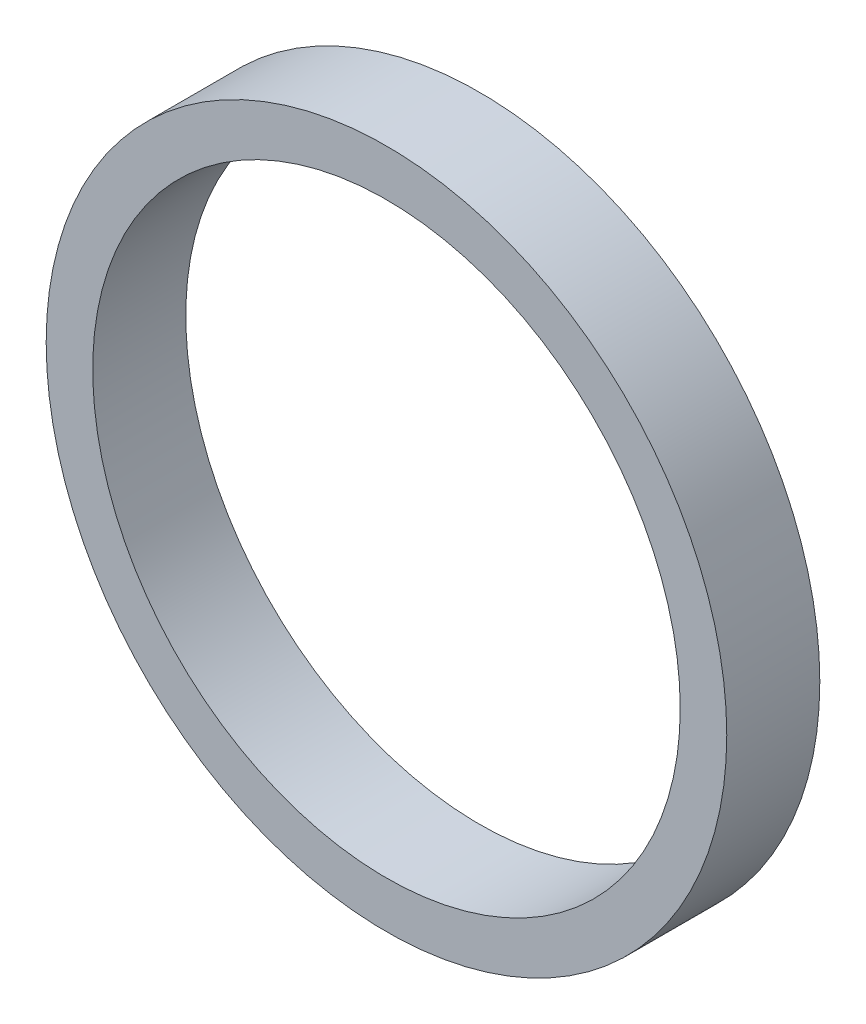
ISO-10303-21;
HEADER;
FILE_DESCRIPTION(('STEP AP214'),'2;1');
FILE_NAME('part.step','',(''),(''),'','','');
FILE_SCHEMA(('AUTOMOTIVE_DESIGN { 1 0 10303 214 1 1 1 1 }'));
ENDSEC;
DATA;
#1=APPLICATION_CONTEXT('core data for automotive mechanical design processes');
#2=APPLICATION_PROTOCOL_DEFINITION('international standard','automotive_design',2000,#1);
#3=PRODUCT_CONTEXT('',#1,'mechanical');
#4=PRODUCT('Part','Part','',(#3));
#5=PRODUCT_RELATED_PRODUCT_CATEGORY('part','',(#4));
#6=PRODUCT_DEFINITION_FORMATION('','',#4);
#7=PRODUCT_DEFINITION_CONTEXT('part definition',#1,'design');
#8=PRODUCT_DEFINITION('design','',#6,#7);
#9=PRODUCT_DEFINITION_SHAPE('','',#8);
#10=(LENGTH_UNIT() NAMED_UNIT(*) SI_UNIT(.MILLI.,.METRE.));
#11=(NAMED_UNIT(*) PLANE_ANGLE_UNIT() SI_UNIT($,.RADIAN.));
#12=(NAMED_UNIT(*) SI_UNIT($,.STERADIAN.) SOLID_ANGLE_UNIT());
#13=UNCERTAINTY_MEASURE_WITH_UNIT(LENGTH_MEASURE(1.E-05),#10,'distance_accuracy_value','');
#14=(GEOMETRIC_REPRESENTATION_CONTEXT(3) GLOBAL_UNCERTAINTY_ASSIGNED_CONTEXT((#13)) GLOBAL_UNIT_ASSIGNED_CONTEXT((#10,
#11,#12)) REPRESENTATION_CONTEXT('',''));
#15=CARTESIAN_POINT('',(0.,0.,0.));
#16=DIRECTION('',(0.,0.,1.));
#17=DIRECTION('',(1.,0.,0.));
#18=AXIS2_PLACEMENT_3D('',#15,#16,#17);
#19=CARTESIAN_POINT('',(0.,0.,0.));
#20=DIRECTION('',(0.,0.,1.));
#21=DIRECTION('',(1.,0.,0.));
#22=AXIS2_PLACEMENT_3D('',#19,#20,#21);
#23=CYLINDRICAL_SURFACE('',#22,31.568);
#24=CARTESIAN_POINT('',(0.,0.,5.));
#25=DIRECTION('',(0.,0.,1.));
#26=DIRECTION('',(1.,0.,0.));
#27=AXIS2_PLACEMENT_3D('',#24,#25,#26);
#28=CIRCLE('',#27,31.568);
#29=CARTESIAN_POINT('',(31.568,0.,5.));
#30=VERTEX_POINT('',#29);
#31=EDGE_CURVE('E26',#30,#30,#28,.T.);
#32=ORIENTED_EDGE('',*,*,#31,.T.);
#33=EDGE_LOOP('',(#32));
#34=FACE_BOUND('',#33,.T.);
#35=CARTESIAN_POINT('',(0.,0.,-5.));
#36=DIRECTION('',(0.,0.,1.));
#37=DIRECTION('',(1.,0.,0.));
#38=AXIS2_PLACEMENT_3D('',#35,#36,#37);
#39=CIRCLE('',#38,31.568);
#40=CARTESIAN_POINT('',(31.568,0.,-5.));
#41=VERTEX_POINT('',#40);
#42=EDGE_CURVE('E17',#41,#41,#39,.T.);
#43=ORIENTED_EDGE('',*,*,#42,.F.);
#44=EDGE_LOOP('',(#43));
#45=FACE_BOUND('',#44,.T.);
#46=ADVANCED_FACE('F14',(#34,#45),#23,.F.);
#47=CARTESIAN_POINT('',(0.,0.,-5.));
#48=DIRECTION('',(0.,0.,-1.));
#49=DIRECTION('',(-1.,0.,0.));
#50=AXIS2_PLACEMENT_3D('',#47,#48,#49);
#51=PLANE('',#50);
#52=ORIENTED_EDGE('',*,*,#42,.T.);
#53=EDGE_LOOP('',(#52));
#54=FACE_BOUND('',#53,.T.);
#55=CARTESIAN_POINT('',(0.,0.,-5.));
#56=DIRECTION('',(0.,0.,1.));
#57=DIRECTION('',(1.,0.,0.));
#58=AXIS2_PLACEMENT_3D('',#55,#56,#57);
#59=CIRCLE('',#58,36.568);
#60=CARTESIAN_POINT('',(36.568,0.,-5.));
#61=VERTEX_POINT('',#60);
#62=EDGE_CURVE('E21',#61,#61,#59,.T.);
#63=ORIENTED_EDGE('',*,*,#62,.F.);
#64=EDGE_LOOP('',(#63));
#65=FACE_BOUND('',#64,.T.);
#66=ADVANCED_FACE('F34',(#54,#65),#51,.T.);
#67=CARTESIAN_POINT('',(0.,0.,5.));
#68=DIRECTION('',(0.,0.,-1.));
#69=DIRECTION('',(-1.,0.,0.));
#70=AXIS2_PLACEMENT_3D('',#67,#68,#69);
#71=PLANE('',#70);
#72=ORIENTED_EDGE('',*,*,#31,.F.);
#73=EDGE_LOOP('',(#72));
#74=FACE_BOUND('',#73,.T.);
#75=CARTESIAN_POINT('',(0.,0.,5.));
#76=DIRECTION('',(0.,0.,1.));
#77=DIRECTION('',(1.,0.,0.));
#78=AXIS2_PLACEMENT_3D('',#75,#76,#77);
#79=CIRCLE('',#78,36.568);
#80=CARTESIAN_POINT('',(36.568,0.,5.));
#81=VERTEX_POINT('',#80);
#82=EDGE_CURVE('E9',#81,#81,#79,.F.);
#83=ORIENTED_EDGE('',*,*,#82,.F.);
#84=EDGE_LOOP('',(#83));
#85=FACE_BOUND('',#84,.T.);
#86=ADVANCED_FACE('F42',(#74,#85),#71,.F.);
#87=CARTESIAN_POINT('',(0.,0.,0.));
#88=DIRECTION('',(0.,0.,1.));
#89=DIRECTION('',(1.,0.,0.));
#90=AXIS2_PLACEMENT_3D('',#87,#88,#89);
#91=CYLINDRICAL_SURFACE('',#90,36.568);
#92=ORIENTED_EDGE('',*,*,#82,.T.);
#93=EDGE_LOOP('',(#92));
#94=FACE_BOUND('',#93,.T.);
#95=ORIENTED_EDGE('',*,*,#62,.T.);
#96=EDGE_LOOP('',(#95));
#97=FACE_BOUND('',#96,.T.);
#98=ADVANCED_FACE('F43',(#94,#97),#91,.T.);
#99=CLOSED_SHELL('',(#46,#66,#86,#98));
#100=MANIFOLD_SOLID_BREP('B1',#99);
#101=ADVANCED_BREP_SHAPE_REPRESENTATION('',(#18,#100),#14);
#102=SHAPE_DEFINITION_REPRESENTATION(#9,#101);
ENDSEC;
END-ISO-10303-21;
